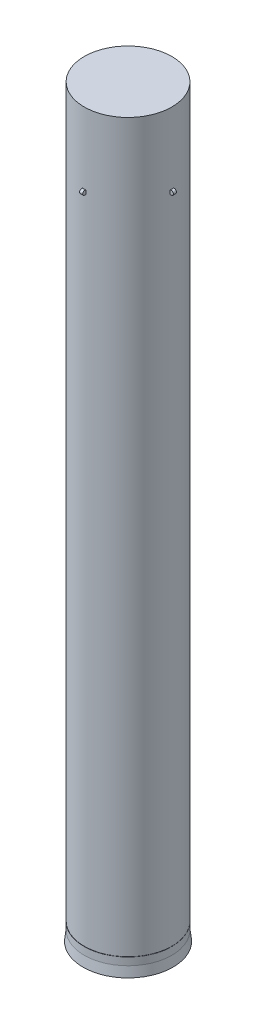
ISO-10303-21;
HEADER;
FILE_DESCRIPTION(('STEP AP214'),'2;1');
FILE_NAME('part.step','',(''),(''),'','','');
FILE_SCHEMA(('AUTOMOTIVE_DESIGN { 1 0 10303 214 1 1 1 1 }'));
ENDSEC;
DATA;
#1=APPLICATION_CONTEXT('core data for automotive mechanical design processes');
#2=APPLICATION_PROTOCOL_DEFINITION('international standard','automotive_design',2000,#1);
#3=PRODUCT_CONTEXT('',#1,'mechanical');
#4=PRODUCT('Part','Part','',(#3));
#5=PRODUCT_RELATED_PRODUCT_CATEGORY('part','',(#4));
#6=PRODUCT_DEFINITION_FORMATION('','',#4);
#7=PRODUCT_DEFINITION_CONTEXT('part definition',#1,'design');
#8=PRODUCT_DEFINITION('design','',#6,#7);
#9=PRODUCT_DEFINITION_SHAPE('','',#8);
#10=(LENGTH_UNIT() NAMED_UNIT(*) SI_UNIT(.MILLI.,.METRE.));
#11=(NAMED_UNIT(*) PLANE_ANGLE_UNIT() SI_UNIT($,.RADIAN.));
#12=(NAMED_UNIT(*) SI_UNIT($,.STERADIAN.) SOLID_ANGLE_UNIT());
#13=UNCERTAINTY_MEASURE_WITH_UNIT(LENGTH_MEASURE(1.E-05),#10,'distance_accuracy_value','');
#14=(GEOMETRIC_REPRESENTATION_CONTEXT(3) GLOBAL_UNCERTAINTY_ASSIGNED_CONTEXT((#13)) GLOBAL_UNIT_ASSIGNED_CONTEXT((#10,
#11,#12)) REPRESENTATION_CONTEXT('',''));
#15=CARTESIAN_POINT('',(0.,0.,0.));
#16=DIRECTION('',(0.,0.,1.));
#17=DIRECTION('',(1.,0.,0.));
#18=AXIS2_PLACEMENT_3D('',#15,#16,#17);
#19=CARTESIAN_POINT('',(0.,0.,0.));
#20=DIRECTION('',(0.,-1.,0.));
#21=DIRECTION('',(0.,0.,-1.));
#22=AXIS2_PLACEMENT_3D('',#19,#20,#21);
#23=CYLINDRICAL_SURFACE('',#22,4500.);
#24=CARTESIAN_POINT('',(0.,1792.,0.));
#25=DIRECTION('',(0.,1.,0.));
#26=DIRECTION('',(0.,0.,1.));
#27=AXIS2_PLACEMENT_3D('',#24,#25,#26);
#28=CIRCLE('',#27,4500.);
#29=CARTESIAN_POINT('',(0.,1792.,4500.));
#30=VERTEX_POINT('',#29);
#31=EDGE_CURVE('E194',#30,#30,#28,.T.);
#32=ORIENTED_EDGE('',*,*,#31,.F.);
#33=EDGE_LOOP('',(#32));
#34=FACE_BOUND('',#33,.T.);
#35=CARTESIAN_POINT('',(0.,1000.,0.));
#36=DIRECTION('',(0.,-1.,0.));
#37=DIRECTION('',(0.,0.,-1.));
#38=AXIS2_PLACEMENT_3D('',#35,#36,#37);
#39=CIRCLE('',#38,4500.);
#40=CARTESIAN_POINT('',(0.,1000.,-4500.));
#41=VERTEX_POINT('',#40);
#42=EDGE_CURVE('E204',#41,#41,#39,.T.);
#43=ORIENTED_EDGE('',*,*,#42,.F.);
#44=EDGE_LOOP('',(#43));
#45=FACE_BOUND('',#44,.T.);
#46=ADVANCED_FACE('F39',(#34,#45),#23,.T.);
#47=CARTESIAN_POINT('',(0.,0.,0.));
#48=DIRECTION('',(0.,-1.,0.));
#49=DIRECTION('',(0.,0.,-1.));
#50=AXIS2_PLACEMENT_3D('',#47,#48,#49);
#51=CONICAL_SURFACE('',#50,4620.,0.119428926018339);
#52=ORIENTED_EDGE('',*,*,#42,.T.);
#53=EDGE_LOOP('',(#52));
#54=FACE_BOUND('',#53,.T.);
#55=CARTESIAN_POINT('',(0.,0.,0.));
#56=DIRECTION('',(0.,-1.,0.));
#57=DIRECTION('',(0.,0.,-1.));
#58=AXIS2_PLACEMENT_3D('',#55,#56,#57);
#59=CIRCLE('',#58,4620.);
#60=CARTESIAN_POINT('',(0.,0.,-4620.));
#61=VERTEX_POINT('',#60);
#62=EDGE_CURVE('E210',#61,#61,#59,.T.);
#63=ORIENTED_EDGE('',*,*,#62,.F.);
#64=EDGE_LOOP('',(#63));
#65=FACE_BOUND('',#64,.T.);
#66=ADVANCED_FACE('F295',(#54,#65),#51,.T.);
#67=CARTESIAN_POINT('',(4620.,0.,0.));
#68=DIRECTION('',(0.,-1.,0.));
#69=DIRECTION('',(0.,0.,-1.));
#70=AXIS2_PLACEMENT_3D('',#67,#68,#69);
#71=PLANE('',#70);
#72=ORIENTED_EDGE('',*,*,#62,.T.);
#73=EDGE_LOOP('',(#72));
#74=FACE_BOUND('',#73,.T.);
#75=CARTESIAN_POINT('',(0.,0.,0.));
#76=DIRECTION('',(0.,-1.,0.));
#77=DIRECTION('',(0.,0.,-1.));
#78=AXIS2_PLACEMENT_3D('',#75,#76,#77);
#79=CIRCLE('',#78,4300.);
#80=CARTESIAN_POINT('',(0.,0.,-4300.));
#81=VERTEX_POINT('',#80);
#82=EDGE_CURVE('E209',#81,#81,#79,.T.);
#83=ORIENTED_EDGE('',*,*,#82,.F.);
#84=EDGE_LOOP('',(#83));
#85=FACE_BOUND('',#84,.T.);
#86=ADVANCED_FACE('F298',(#74,#85),#71,.T.);
#87=CARTESIAN_POINT('',(0.,0.,0.));
#88=DIRECTION('',(0.,-1.,0.));
#89=DIRECTION('',(0.,0.,-1.));
#90=AXIS2_PLACEMENT_3D('',#87,#88,#89);
#91=CYLINDRICAL_SURFACE('',#90,4300.);
#92=ORIENTED_EDGE('',*,*,#82,.T.);
#93=EDGE_LOOP('',(#92));
#94=FACE_BOUND('',#93,.T.);
#95=CARTESIAN_POINT('',(0.,73000.,0.));
#96=DIRECTION('',(0.,-1.,0.));
#97=DIRECTION('',(0.,0.,-1.));
#98=AXIS2_PLACEMENT_3D('',#95,#96,#97);
#99=CIRCLE('',#98,4300.);
#100=CARTESIAN_POINT('',(0.,73000.,-4300.));
#101=VERTEX_POINT('',#100);
#102=EDGE_CURVE('E188',#101,#101,#99,.T.);
#103=ORIENTED_EDGE('',*,*,#102,.F.);
#104=EDGE_LOOP('',(#103));
#105=FACE_BOUND('',#104,.T.);
#106=ADVANCED_FACE('F310',(#94,#105),#91,.F.);
#107=CARTESIAN_POINT('',(0.,75000.,0.));
#108=DIRECTION('',(0.,-1.,0.));
#109=DIRECTION('',(0.,0.,-1.));
#110=AXIS2_PLACEMENT_3D('',#107,#108,#109);
#111=CONICAL_SURFACE('',#110,0.,1.13544305164259);
#112=ORIENTED_EDGE('',*,*,#102,.T.);
#113=EDGE_LOOP('',(#112));
#114=FACE_BOUND('',#113,.T.);
#115=CARTESIAN_POINT('',(0.,75000.,0.));
#116=VERTEX_POINT('',#115);
#117=VERTEX_LOOP('',#116);
#118=FACE_BOUND('',#117,.T.);
#119=ADVANCED_FACE('F312',(#114,#118),#111,.F.);
#120=CARTESIAN_POINT('',(0.,1800.,0.));
#121=DIRECTION('',(0.,-1.,0.));
#122=DIRECTION('',(0.,0.,-1.));
#123=AXIS2_PLACEMENT_3D('',#120,#121,#122);
#124=TOROIDAL_SURFACE('',#123,4506.,9.99999999999967);
#125=ORIENTED_EDGE('',*,*,#31,.T.);
#126=EDGE_LOOP('',(#125));
#127=FACE_BOUND('',#126,.T.);
#128=CARTESIAN_POINT('',(0.,1808.,0.));
#129=DIRECTION('',(0.,-1.,0.));
#130=DIRECTION('',(0.,0.,-1.));
#131=AXIS2_PLACEMENT_3D('',#128,#129,#130);
#132=CIRCLE('',#131,4500.);
#133=CARTESIAN_POINT('',(0.,1808.,-4500.));
#134=VERTEX_POINT('',#133);
#135=EDGE_CURVE('E198',#134,#134,#132,.T.);
#136=ORIENTED_EDGE('',*,*,#135,.T.);
#137=EDGE_LOOP('',(#136));
#138=FACE_BOUND('',#137,.T.);
#139=ADVANCED_FACE('F162',(#127,#138),#124,.T.);
#140=CARTESIAN_POINT('',(0.,76500.,0.));
#141=DIRECTION('',(0.,1.,0.));
#142=DIRECTION('',(0.,0.,1.));
#143=AXIS2_PLACEMENT_3D('',#140,#141,#142);
#144=PLANE('',#143);
#145=CARTESIAN_POINT('',(0.,76500.,0.));
#146=DIRECTION('',(0.,-1.,0.));
#147=DIRECTION('',(0.,0.,-1.));
#148=AXIS2_PLACEMENT_3D('',#145,#146,#147);
#149=CIRCLE('',#148,4500.);
#150=CARTESIAN_POINT('',(0.,76500.,-4500.));
#151=VERTEX_POINT('',#150);
#152=EDGE_CURVE('E203',#151,#151,#149,.T.);
#153=ORIENTED_EDGE('',*,*,#152,.F.);
#154=EDGE_LOOP('',(#153));
#155=FACE_BOUND('',#154,.T.);
#156=ADVANCED_FACE('F41',(#155),#144,.T.);
#157=DIRECTION('',(0.,-1.,0.));
#158=VECTOR('',#157,1.);
#159=CARTESIAN_POINT('',(-160.,0.,4497.15465600195));
#160=LINE('',#159,#158);
#161=CARTESIAN_POINT('',(-160.,69194.4809379295,4497.15465600195));
#162=VERTEX_POINT('',#161);
#163=CARTESIAN_POINT('',(-160.,68805.5190620705,4497.15465600195));
#164=VERTEX_POINT('',#163);
#165=EDGE_CURVE('E11',#162,#164,#160,.T.);
#166=ORIENTED_EDGE('',*,*,#165,.F.);
#167=CARTESIAN_POINT('',(-160.,69194.4809379295,4497.15465600195));
#168=CARTESIAN_POINT('',(-153.335593789597,69194.6063149376,4497.39176282327));
#169=CARTESIAN_POINT('',(-146.670505032465,69194.7233250094,4497.61406057519));
#170=CARTESIAN_POINT('',(-133.339139537101,69194.9409577402,4498.02902921823));
#171=CARTESIAN_POINT('',(-126.672862799204,69195.0415804038,4498.2217001177));
#172=CARTESIAN_POINT('',(-113.339304759071,69195.226784708,4498.57740619916));
#173=CARTESIAN_POINT('',(-106.672023458367,69195.3113663729,4498.7404414259));
#174=CARTESIAN_POINT('',(-93.3366265574539,69195.4647640253,4499.03686966148));
#175=CARTESIAN_POINT('',(-86.6685109571762,69195.5335800114,4499.17026266786));
#176=CARTESIAN_POINT('',(-66.6685182895194,69195.716690718,4499.52587423657));
#177=CARTESIAN_POINT('',(-53.3356029489949,69195.8077226759,4499.70366919765));
#178=CARTESIAN_POINT('',(-26.6684584062423,69195.9289670491,4499.94073211992));
#179=CARTESIAN_POINT('',(-13.334229203121,69195.9591794227,4500.));
#180=CARTESIAN_POINT('',(13.3342292031216,69195.9591794227,4500.));
#181=CARTESIAN_POINT('',(26.6684584062429,69195.9289670491,4499.94073211992));
#182=CARTESIAN_POINT('',(53.3356029489956,69195.8077226759,4499.70366919765));
#183=CARTESIAN_POINT('',(66.66851828952,69195.716690718,4499.52587423657));
#184=CARTESIAN_POINT('',(86.6685109571769,69195.5335800114,4499.17026266786));
#185=CARTESIAN_POINT('',(93.3366265574546,69195.4647640253,4499.03686966148));
#186=CARTESIAN_POINT('',(106.672023458367,69195.3113663729,4498.7404414259));
#187=CARTESIAN_POINT('',(113.339304759072,69195.226784708,4498.57740619916));
#188=CARTESIAN_POINT('',(126.672862799205,69195.0415804038,4498.2217001177));
#189=CARTESIAN_POINT('',(133.339139537102,69194.9409577402,4498.02902921823));
#190=CARTESIAN_POINT('',(146.670505032466,69194.7233250094,4497.61406057519));
#191=CARTESIAN_POINT('',(153.335593789597,69194.6063149376,4497.39176282327));
#192=CARTESIAN_POINT('',(160.,69194.4809379295,4497.15465600195));
#193=B_SPLINE_CURVE_WITH_KNOTS('',3,(#167,#168,#169,#170,#171,#172,#173,#174,#175,#176,#177,
#178,#179,#180,#181,#182,#183,#184,#185,#186,#187,#188,#189,#190,#191,#192),.UNSPECIFIED.,.F.,
.F.,(4,2,2,2,2,2,2,2,2,2,2,2,4),(0.,20.009379155884,40.0187526619821,60.0280959502037,
80.0374409041522,120.039947029182,160.042480536044,200.045014042906,240.047520167936,
260.056865121885,280.066208410106,300.075581916205,320.084961072089),.UNSPECIFIED.);
#194=CARTESIAN_POINT('',(160.,69194.4809379295,4497.15465600195));
#195=VERTEX_POINT('',#194);
#196=EDGE_CURVE('E50',#162,#195,#193,.T.);
#197=ORIENTED_EDGE('',*,*,#196,.T.);
#198=DIRECTION('',(0.,-1.,0.));
#199=VECTOR('',#198,1.);
#200=CARTESIAN_POINT('',(160.,0.,4497.15465600195));
#201=LINE('',#200,#199);
#202=CARTESIAN_POINT('',(160.,68805.5190620705,4497.15465600195));
#203=VERTEX_POINT('',#202);
#204=EDGE_CURVE('E231',#195,#203,#201,.T.);
#205=ORIENTED_EDGE('',*,*,#204,.T.);
#206=CARTESIAN_POINT('',(160.,68805.5190620705,4497.15465600195));
#207=CARTESIAN_POINT('',(153.335593789597,68805.3936850624,4497.39176282327));
#208=CARTESIAN_POINT('',(146.670505032466,68805.2766749906,4497.61406057519));
#209=CARTESIAN_POINT('',(133.339139537102,68805.0590422598,4498.02902921823));
#210=CARTESIAN_POINT('',(126.672862799205,68804.9584195962,4498.2217001177));
#211=CARTESIAN_POINT('',(113.339304759072,68804.773215292,4498.57740619916));
#212=CARTESIAN_POINT('',(106.672023458367,68804.6886336271,4498.7404414259));
#213=CARTESIAN_POINT('',(93.3366265574545,68804.5352359747,4499.03686966148));
#214=CARTESIAN_POINT('',(86.6685109571768,68804.4664199886,4499.17026266786));
#215=CARTESIAN_POINT('',(66.6685182895199,68804.283309282,4499.52587423657));
#216=CARTESIAN_POINT('',(53.3356029489955,68804.1922773241,4499.70366919765));
#217=CARTESIAN_POINT('',(26.6684584062428,68804.0710329509,4499.94073211992));
#218=CARTESIAN_POINT('',(13.3342292031215,68804.0408205773,4500.));
#219=CARTESIAN_POINT('',(-13.3342292031211,68804.0408205773,4500.));
#220=CARTESIAN_POINT('',(-26.6684584062424,68804.0710329509,4499.94073211992));
#221=CARTESIAN_POINT('',(-53.335602948995,68804.1922773241,4499.70366919765));
#222=CARTESIAN_POINT('',(-66.6685182895194,68804.283309282,4499.52587423657));
#223=CARTESIAN_POINT('',(-86.6685109571763,68804.4664199886,4499.17026266786));
#224=CARTESIAN_POINT('',(-93.336626557454,68804.5352359747,4499.03686966148));
#225=CARTESIAN_POINT('',(-106.672023458367,68804.6886336271,4498.7404414259));
#226=CARTESIAN_POINT('',(-113.339304759071,68804.773215292,4498.57740619916));
#227=CARTESIAN_POINT('',(-126.672862799204,68804.9584195962,4498.2217001177));
#228=CARTESIAN_POINT('',(-133.339139537101,68805.0590422598,4498.02902921823));
#229=CARTESIAN_POINT('',(-146.670505032465,68805.2766749906,4497.61406057519));
#230=CARTESIAN_POINT('',(-153.335593789597,68805.3936850624,4497.39176282327));
#231=CARTESIAN_POINT('',(-160.,68805.5190620705,4497.15465600195));
#232=B_SPLINE_CURVE_WITH_KNOTS('',3,(#206,#207,#208,#209,#210,#211,#212,#213,#214,#215,#216,
#217,#218,#219,#220,#221,#222,#223,#224,#225,#226,#227,#228,#229,#230,#231),.UNSPECIFIED.,.F.,
.F.,(4,2,2,2,2,2,2,2,2,2,2,2,4),(0.,20.009379155884,40.0187526619821,60.0280959502037,
80.0374409041522,120.039947029182,160.042480536044,200.045014042906,240.047520167936,
260.056865121885,280.066208410106,300.075581916205,320.084961072089),.UNSPECIFIED.);
#233=EDGE_CURVE('E234',#203,#164,#232,.T.);
#234=ORIENTED_EDGE('',*,*,#233,.T.);
#235=EDGE_LOOP('',(#166,#197,#205,#234));
#236=FACE_BOUND('',#235,.T.);
#237=DIRECTION('',(0.,-1.,0.));
#238=VECTOR('',#237,1.);
#239=CARTESIAN_POINT('',(-4497.15465600195,0.,-159.999999999999));
#240=LINE('',#239,#238);
#241=CARTESIAN_POINT('',(-4497.15465600195,69194.4809379295,-159.999999999999));
#242=VERTEX_POINT('',#241);
#243=CARTESIAN_POINT('',(-4497.15465600195,68805.5190620705,-159.999999999999));
#244=VERTEX_POINT('',#243);
#245=EDGE_CURVE('E240',#242,#244,#240,.T.);
#246=ORIENTED_EDGE('',*,*,#245,.F.);
#247=CARTESIAN_POINT('',(-4497.15465600195,69194.4809379295,-159.999999999999));
#248=CARTESIAN_POINT('',(-4497.39176282327,69194.6063149376,-153.335593789596));
#249=CARTESIAN_POINT('',(-4497.61406057519,69194.7233250094,-146.670505032465));
#250=CARTESIAN_POINT('',(-4498.02902921823,69194.9409577402,-133.339139537101));
#251=CARTESIAN_POINT('',(-4498.2217001177,69195.0415804038,-126.672862799204));
#252=CARTESIAN_POINT('',(-4498.57740619916,69195.226784708,-113.339304759071));
#253=CARTESIAN_POINT('',(-4498.7404414259,69195.3113663729,-106.672023458366));
#254=CARTESIAN_POINT('',(-4499.03686966148,69195.4647640253,-93.3366265574536));
#255=CARTESIAN_POINT('',(-4499.17026266786,69195.5335800114,-86.668510957176));
#256=CARTESIAN_POINT('',(-4499.52587423657,69195.716690718,-66.668518289519));
#257=CARTESIAN_POINT('',(-4499.70366919765,69195.8077226759,-53.3356029489946));
#258=CARTESIAN_POINT('',(-4499.94073211992,69195.9289670491,-26.668458406242));
#259=CARTESIAN_POINT('',(-4500.,69195.9591794227,-13.3342292031207));
#260=CARTESIAN_POINT('',(-4500.,69195.9591794227,13.3342292031219));
#261=CARTESIAN_POINT('',(-4499.94073211992,69195.9289670491,26.6684584062433));
#262=CARTESIAN_POINT('',(-4499.70366919765,69195.8077226759,53.3356029489959));
#263=CARTESIAN_POINT('',(-4499.52587423657,69195.716690718,66.6685182895203));
#264=CARTESIAN_POINT('',(-4499.17026266786,69195.5335800114,86.6685109571772));
#265=CARTESIAN_POINT('',(-4499.03686966148,69195.4647640253,93.3366265574549));
#266=CARTESIAN_POINT('',(-4498.7404414259,69195.3113663729,106.672023458368));
#267=CARTESIAN_POINT('',(-4498.57740619916,69195.226784708,113.339304759072));
#268=CARTESIAN_POINT('',(-4498.2217001177,69195.0415804038,126.672862799205));
#269=CARTESIAN_POINT('',(-4498.02902921822,69194.9409577402,133.339139537102));
#270=CARTESIAN_POINT('',(-4497.61406057519,69194.7233250094,146.670505032466));
#271=CARTESIAN_POINT('',(-4497.39176282327,69194.6063149376,153.335593789598));
#272=CARTESIAN_POINT('',(-4497.15465600195,69194.4809379295,160.000000000001));
#273=B_SPLINE_CURVE_WITH_KNOTS('',3,(#247,#248,#249,#250,#251,#252,#253,#254,#255,#256,#257,
#258,#259,#260,#261,#262,#263,#264,#265,#266,#267,#268,#269,#270,#271,#272),.UNSPECIFIED.,.F.,
.F.,(4,2,2,2,2,2,2,2,2,2,2,2,4),(0.,20.009379155884,40.0187526619821,60.0280959502037,
80.0374409041522,120.039947029182,160.042480536044,200.045014042906,240.047520167937,
260.056865121885,280.066208410107,300.075581916205,320.084961072089),.UNSPECIFIED.);
#274=CARTESIAN_POINT('',(-4497.15465600195,69194.4809379295,160.000000000001));
#275=VERTEX_POINT('',#274);
#276=EDGE_CURVE('E277',#242,#275,#273,.T.);
#277=ORIENTED_EDGE('',*,*,#276,.T.);
#278=DIRECTION('',(0.,-1.,0.));
#279=VECTOR('',#278,1.);
#280=CARTESIAN_POINT('',(-4497.15465600195,0.,160.000000000001));
#281=LINE('',#280,#279);
#282=CARTESIAN_POINT('',(-4497.15465600195,68805.5190620705,160.000000000001));
#283=VERTEX_POINT('',#282);
#284=EDGE_CURVE('E126',#275,#283,#281,.T.);
#285=ORIENTED_EDGE('',*,*,#284,.T.);
#286=CARTESIAN_POINT('',(-4497.15465600195,68805.5190620705,160.000000000001));
#287=CARTESIAN_POINT('',(-4497.39176282327,68805.3936850624,153.335593789598));
#288=CARTESIAN_POINT('',(-4497.61406057519,68805.2766749906,146.670505032466));
#289=CARTESIAN_POINT('',(-4498.02902921822,68805.0590422598,133.339139537102));
#290=CARTESIAN_POINT('',(-4498.2217001177,68804.9584195962,126.672862799205));
#291=CARTESIAN_POINT('',(-4498.57740619916,68804.773215292,113.339304759072));
#292=CARTESIAN_POINT('',(-4498.7404414259,68804.6886336271,106.672023458368));
#293=CARTESIAN_POINT('',(-4499.03686966148,68804.5352359747,93.3366265574548));
#294=CARTESIAN_POINT('',(-4499.17026266786,68804.4664199886,86.6685109571771));
#295=CARTESIAN_POINT('',(-4499.52587423657,68804.283309282,66.6685182895202));
#296=CARTESIAN_POINT('',(-4499.70366919765,68804.1922773241,53.3356029489958));
#297=CARTESIAN_POINT('',(-4499.94073211992,68804.0710329509,26.6684584062431));
#298=CARTESIAN_POINT('',(-4500.,68804.0408205773,13.3342292031218));
#299=CARTESIAN_POINT('',(-4500.,68804.0408205773,-13.3342292031208));
#300=CARTESIAN_POINT('',(-4499.94073211992,68804.0710329509,-26.6684584062421));
#301=CARTESIAN_POINT('',(-4499.70366919765,68804.1922773241,-53.3356029489947));
#302=CARTESIAN_POINT('',(-4499.52587423657,68804.283309282,-66.6685182895192));
#303=CARTESIAN_POINT('',(-4499.17026266786,68804.4664199886,-86.6685109571761));
#304=CARTESIAN_POINT('',(-4499.03686966148,68804.5352359747,-93.3366265574537));
#305=CARTESIAN_POINT('',(-4498.7404414259,68804.6886336271,-106.672023458366));
#306=CARTESIAN_POINT('',(-4498.57740619916,68804.773215292,-113.339304759071));
#307=CARTESIAN_POINT('',(-4498.2217001177,68804.9584195962,-126.672862799204));
#308=CARTESIAN_POINT('',(-4498.02902921823,68805.0590422598,-133.339139537101));
#309=CARTESIAN_POINT('',(-4497.61406057519,68805.2766749906,-146.670505032465));
#310=CARTESIAN_POINT('',(-4497.39176282327,68805.3936850624,-153.335593789597));
#311=CARTESIAN_POINT('',(-4497.15465600195,68805.5190620705,-160.));
#312=B_SPLINE_CURVE_WITH_KNOTS('',3,(#286,#287,#288,#289,#290,#291,#292,#293,#294,#295,#296,
#297,#298,#299,#300,#301,#302,#303,#304,#305,#306,#307,#308,#309,#310,#311),.UNSPECIFIED.,.F.,
.F.,(4,2,2,2,2,2,2,2,2,2,2,2,4),(0.,20.0093791558839,40.0187526619821,60.0280959502037,
80.0374409041522,120.039947029182,160.042480536044,200.045014042906,240.047520167937,
260.056865121885,280.066208410107,300.075581916205,320.084961072089),.UNSPECIFIED.);
#313=EDGE_CURVE('E269',#283,#244,#312,.T.);
#314=ORIENTED_EDGE('',*,*,#313,.T.);
#315=EDGE_LOOP('',(#246,#277,#285,#314));
#316=FACE_BOUND('',#315,.T.);
#317=DIRECTION('',(0.,-1.,0.));
#318=VECTOR('',#317,1.);
#319=CARTESIAN_POINT('',(159.999999999999,0.,-4497.15465600195));
#320=LINE('',#319,#318);
#321=CARTESIAN_POINT('',(159.999999999999,69194.4809379295,-4497.15465600195));
#322=VERTEX_POINT('',#321);
#323=CARTESIAN_POINT('',(159.999999999999,68805.5190620705,-4497.15465600195));
#324=VERTEX_POINT('',#323);
#325=EDGE_CURVE('E127',#322,#324,#320,.T.);
#326=ORIENTED_EDGE('',*,*,#325,.F.);
#327=CARTESIAN_POINT('',(159.999999999999,69194.4809379295,-4497.15465600195));
#328=CARTESIAN_POINT('',(153.335593789596,69194.6063149376,-4497.39176282327));
#329=CARTESIAN_POINT('',(146.670505032465,69194.7233250094,-4497.61406057519));
#330=CARTESIAN_POINT('',(133.3391395371,69194.9409577402,-4498.02902921823));
#331=CARTESIAN_POINT('',(126.672862799204,69195.0415804038,-4498.2217001177));
#332=CARTESIAN_POINT('',(113.339304759071,69195.226784708,-4498.57740619916));
#333=CARTESIAN_POINT('',(106.672023458366,69195.3113663729,-4498.7404414259));
#334=CARTESIAN_POINT('',(93.3366265574534,69195.4647640253,-4499.03686966148));
#335=CARTESIAN_POINT('',(86.6685109571757,69195.5335800114,-4499.17026266786));
#336=CARTESIAN_POINT('',(66.6685182895188,69195.716690718,-4499.52587423657));
#337=CARTESIAN_POINT('',(53.3356029489944,69195.8077226759,-4499.70366919765));
#338=CARTESIAN_POINT('',(26.6684584062417,69195.9289670491,-4499.94073211992));
#339=CARTESIAN_POINT('',(13.3342292031204,69195.9591794227,-4500.));
#340=CARTESIAN_POINT('',(-13.3342292031222,69195.9591794227,-4500.));
#341=CARTESIAN_POINT('',(-26.6684584062435,69195.9289670491,-4499.94073211992));
#342=CARTESIAN_POINT('',(-53.3356029489961,69195.8077226759,-4499.70366919765));
#343=CARTESIAN_POINT('',(-66.6685182895206,69195.716690718,-4499.52587423657));
#344=CARTESIAN_POINT('',(-86.6685109571774,69195.5335800114,-4499.17026266786));
#345=CARTESIAN_POINT('',(-93.3366265574551,69195.4647640253,-4499.03686966148));
#346=CARTESIAN_POINT('',(-106.672023458368,69195.3113663729,-4498.7404414259));
#347=CARTESIAN_POINT('',(-113.339304759072,69195.226784708,-4498.57740619916));
#348=CARTESIAN_POINT('',(-126.672862799206,69195.0415804038,-4498.2217001177));
#349=CARTESIAN_POINT('',(-133.339139537102,69194.9409577402,-4498.02902921822));
#350=CARTESIAN_POINT('',(-146.670505032466,69194.7233250094,-4497.61406057519));
#351=CARTESIAN_POINT('',(-153.335593789598,69194.6063149376,-4497.39176282327));
#352=CARTESIAN_POINT('',(-160.000000000001,69194.4809379295,-4497.15465600195));
#353=B_SPLINE_CURVE_WITH_KNOTS('',3,(#327,#328,#329,#330,#331,#332,#333,#334,#335,#336,#337,
#338,#339,#340,#341,#342,#343,#344,#345,#346,#347,#348,#349,#350,#351,#352),.UNSPECIFIED.,.F.,
.F.,(4,2,2,2,2,2,2,2,2,2,2,2,4),(0.,20.009379155884,40.0187526619821,60.0280959502037,
80.0374409041522,120.039947029182,160.042480536044,200.045014042906,240.047520167936,
260.056865121885,280.066208410106,300.075581916205,320.084961072089),.UNSPECIFIED.);
#354=CARTESIAN_POINT('',(-160.000000000001,69194.4809379295,-4497.15465600195));
#355=VERTEX_POINT('',#354);
#356=EDGE_CURVE('E118',#322,#355,#353,.T.);
#357=ORIENTED_EDGE('',*,*,#356,.T.);
#358=DIRECTION('',(0.,-1.,0.));
#359=VECTOR('',#358,1.);
#360=CARTESIAN_POINT('',(-160.000000000001,0.,-4497.15465600195));
#361=LINE('',#360,#359);
#362=CARTESIAN_POINT('',(-160.000000000001,68805.5190620705,-4497.15465600195));
#363=VERTEX_POINT('',#362);
#364=EDGE_CURVE('E104',#355,#363,#361,.T.);
#365=ORIENTED_EDGE('',*,*,#364,.T.);
#366=CARTESIAN_POINT('',(-160.000000000001,68805.5190620705,-4497.15465600195));
#367=CARTESIAN_POINT('',(-153.335593789598,68805.3936850624,-4497.39176282327));
#368=CARTESIAN_POINT('',(-146.670505032466,68805.2766749906,-4497.61406057519));
#369=CARTESIAN_POINT('',(-133.339139537102,68805.0590422598,-4498.02902921822));
#370=CARTESIAN_POINT('',(-126.672862799206,68804.9584195962,-4498.2217001177));
#371=CARTESIAN_POINT('',(-113.339304759072,68804.773215292,-4498.57740619916));
#372=CARTESIAN_POINT('',(-106.672023458368,68804.6886336271,-4498.7404414259));
#373=CARTESIAN_POINT('',(-93.336626557455,68804.5352359747,-4499.03686966148));
#374=CARTESIAN_POINT('',(-86.6685109571774,68804.4664199886,-4499.17026266786));
#375=CARTESIAN_POINT('',(-66.6685182895205,68804.283309282,-4499.52587423657));
#376=CARTESIAN_POINT('',(-53.335602948996,68804.1922773241,-4499.70366919765));
#377=CARTESIAN_POINT('',(-26.6684584062434,68804.0710329509,-4499.94073211992));
#378=CARTESIAN_POINT('',(-13.3342292031221,68804.0408205773,-4500.));
#379=CARTESIAN_POINT('',(13.3342292031205,68804.0408205773,-4500.));
#380=CARTESIAN_POINT('',(26.6684584062418,68804.0710329509,-4499.94073211992));
#381=CARTESIAN_POINT('',(53.3356029489945,68804.1922773241,-4499.70366919765));
#382=CARTESIAN_POINT('',(66.6685182895189,68804.283309282,-4499.52587423657));
#383=CARTESIAN_POINT('',(86.6685109571758,68804.4664199886,-4499.17026266786));
#384=CARTESIAN_POINT('',(93.3366265574535,68804.5352359747,-4499.03686966148));
#385=CARTESIAN_POINT('',(106.672023458366,68804.6886336271,-4498.7404414259));
#386=CARTESIAN_POINT('',(113.339304759071,68804.773215292,-4498.57740619916));
#387=CARTESIAN_POINT('',(126.672862799204,68804.9584195962,-4498.2217001177));
#388=CARTESIAN_POINT('',(133.3391395371,68805.0590422598,-4498.02902921823));
#389=CARTESIAN_POINT('',(146.670505032465,68805.2766749906,-4497.61406057519));
#390=CARTESIAN_POINT('',(153.335593789596,68805.3936850624,-4497.39176282327));
#391=CARTESIAN_POINT('',(159.999999999999,68805.5190620705,-4497.15465600195));
#392=B_SPLINE_CURVE_WITH_KNOTS('',3,(#366,#367,#368,#369,#370,#371,#372,#373,#374,#375,#376,
#377,#378,#379,#380,#381,#382,#383,#384,#385,#386,#387,#388,#389,#390,#391),.UNSPECIFIED.,.F.,
.F.,(4,2,2,2,2,2,2,2,2,2,2,2,4),(0.,20.0093791558839,40.0187526619821,60.0280959502037,
80.0374409041522,120.039947029182,160.042480536044,200.045014042906,240.047520167936,
260.056865121885,280.066208410106,300.075581916205,320.084961072089),.UNSPECIFIED.);
#393=EDGE_CURVE('E114',#363,#324,#392,.T.);
#394=ORIENTED_EDGE('',*,*,#393,.T.);
#395=EDGE_LOOP('',(#326,#357,#365,#394));
#396=FACE_BOUND('',#395,.T.);
#397=DIRECTION('',(0.,-1.,0.));
#398=VECTOR('',#397,1.);
#399=CARTESIAN_POINT('',(4497.15465600195,0.,160.));
#400=LINE('',#399,#398);
#401=CARTESIAN_POINT('',(4497.15465600195,69194.4809379295,160.));
#402=VERTEX_POINT('',#401);
#403=CARTESIAN_POINT('',(4497.15465600195,68805.5190620705,160.));
#404=VERTEX_POINT('',#403);
#405=EDGE_CURVE('E111',#402,#404,#400,.T.);
#406=ORIENTED_EDGE('',*,*,#405,.F.);
#407=CARTESIAN_POINT('',(4497.15465600195,69194.4809379295,160.));
#408=CARTESIAN_POINT('',(4497.39176282327,69194.6063149376,153.335593789597));
#409=CARTESIAN_POINT('',(4497.61406057519,69194.7233250094,146.670505032465));
#410=CARTESIAN_POINT('',(4498.02902921823,69194.9409577402,133.339139537101));
#411=CARTESIAN_POINT('',(4498.2217001177,69195.0415804038,126.672862799205));
#412=CARTESIAN_POINT('',(4498.57740619916,69195.226784708,113.339304759071));
#413=CARTESIAN_POINT('',(4498.7404414259,69195.3113663729,106.672023458367));
#414=CARTESIAN_POINT('',(4499.03686966148,69195.4647640253,93.3366265574542));
#415=CARTESIAN_POINT('',(4499.17026266786,69195.5335800114,86.6685109571765));
#416=CARTESIAN_POINT('',(4499.52587423657,69195.716690718,66.6685182895196));
#417=CARTESIAN_POINT('',(4499.70366919765,69195.8077226759,53.3356029489952));
#418=CARTESIAN_POINT('',(4499.94073211992,69195.9289670491,26.6684584062426));
#419=CARTESIAN_POINT('',(4500.,69195.9591794227,13.3342292031213));
#420=CARTESIAN_POINT('',(4500.,69195.9591794227,-13.3342292031214));
#421=CARTESIAN_POINT('',(4499.94073211992,69195.9289670491,-26.6684584062427));
#422=CARTESIAN_POINT('',(4499.70366919765,69195.8077226759,-53.3356029489953));
#423=CARTESIAN_POINT('',(4499.52587423657,69195.716690718,-66.6685182895197));
#424=CARTESIAN_POINT('',(4499.17026266786,69195.5335800114,-86.6685109571766));
#425=CARTESIAN_POINT('',(4499.03686966148,69195.4647640253,-93.3366265574543));
#426=CARTESIAN_POINT('',(4498.7404414259,69195.3113663729,-106.672023458367));
#427=CARTESIAN_POINT('',(4498.57740619916,69195.226784708,-113.339304759071));
#428=CARTESIAN_POINT('',(4498.2217001177,69195.0415804038,-126.672862799205));
#429=CARTESIAN_POINT('',(4498.02902921823,69194.9409577402,-133.339139537101));
#430=CARTESIAN_POINT('',(4497.61406057519,69194.7233250094,-146.670505032466));
#431=CARTESIAN_POINT('',(4497.39176282327,69194.6063149376,-153.335593789597));
#432=CARTESIAN_POINT('',(4497.15465600195,69194.4809379295,-160.));
#433=B_SPLINE_CURVE_WITH_KNOTS('',3,(#407,#408,#409,#410,#411,#412,#413,#414,#415,#416,#417,
#418,#419,#420,#421,#422,#423,#424,#425,#426,#427,#428,#429,#430,#431,#432),.UNSPECIFIED.,.F.,
.F.,(4,2,2,2,2,2,2,2,2,2,2,2,4),(0.,20.009379155884,40.0187526619821,60.0280959502037,
80.0374409041522,120.039947029182,160.042480536044,200.045014042906,240.047520167936,
260.056865121885,280.066208410106,300.075581916205,320.084961072089),.UNSPECIFIED.);
#434=CARTESIAN_POINT('',(4497.15465600195,69194.4809379295,-160.));
#435=VERTEX_POINT('',#434);
#436=EDGE_CURVE('E173',#402,#435,#433,.T.);
#437=ORIENTED_EDGE('',*,*,#436,.T.);
#438=DIRECTION('',(0.,-1.,0.));
#439=VECTOR('',#438,1.);
#440=CARTESIAN_POINT('',(4497.15465600195,0.,-160.));
#441=LINE('',#440,#439);
#442=CARTESIAN_POINT('',(4497.15465600195,68805.5190620705,-160.));
#443=VERTEX_POINT('',#442);
#444=EDGE_CURVE('E193',#435,#443,#441,.T.);
#445=ORIENTED_EDGE('',*,*,#444,.T.);
#446=CARTESIAN_POINT('',(4497.15465600195,68805.5190620705,-160.));
#447=CARTESIAN_POINT('',(4497.39176282327,68805.3936850624,-153.335593789597));
#448=CARTESIAN_POINT('',(4497.61406057519,68805.2766749906,-146.670505032465));
#449=CARTESIAN_POINT('',(4498.02902921823,68805.0590422598,-133.339139537101));
#450=CARTESIAN_POINT('',(4498.2217001177,68804.9584195962,-126.672862799205));
#451=CARTESIAN_POINT('',(4498.57740619916,68804.773215292,-113.339304759071));
#452=CARTESIAN_POINT('',(4498.7404414259,68804.6886336271,-106.672023458367));
#453=CARTESIAN_POINT('',(4499.03686966148,68804.5352359747,-93.3366265574542));
#454=CARTESIAN_POINT('',(4499.17026266786,68804.4664199886,-86.6685109571765));
#455=CARTESIAN_POINT('',(4499.52587423657,68804.283309282,-66.6685182895196));
#456=CARTESIAN_POINT('',(4499.70366919765,68804.1922773241,-53.3356029489952));
#457=CARTESIAN_POINT('',(4499.94073211992,68804.0710329509,-26.6684584062426));
#458=CARTESIAN_POINT('',(4500.,68804.0408205773,-13.3342292031213));
#459=CARTESIAN_POINT('',(4500.,68804.0408205773,13.3342292031214));
#460=CARTESIAN_POINT('',(4499.94073211992,68804.0710329509,26.6684584062427));
#461=CARTESIAN_POINT('',(4499.70366919765,68804.1922773241,53.3356029489953));
#462=CARTESIAN_POINT('',(4499.52587423657,68804.283309282,66.6685182895197));
#463=CARTESIAN_POINT('',(4499.17026266786,68804.4664199886,86.6685109571766));
#464=CARTESIAN_POINT('',(4499.03686966148,68804.5352359747,93.3366265574543));
#465=CARTESIAN_POINT('',(4498.7404414259,68804.6886336271,106.672023458367));
#466=CARTESIAN_POINT('',(4498.57740619916,68804.773215292,113.339304759071));
#467=CARTESIAN_POINT('',(4498.2217001177,68804.9584195962,126.672862799205));
#468=CARTESIAN_POINT('',(4498.02902921823,68805.0590422598,133.339139537101));
#469=CARTESIAN_POINT('',(4497.61406057519,68805.2766749906,146.670505032466));
#470=CARTESIAN_POINT('',(4497.39176282327,68805.3936850624,153.335593789597));
#471=CARTESIAN_POINT('',(4497.15465600195,68805.5190620705,160.));
#472=B_SPLINE_CURVE_WITH_KNOTS('',3,(#446,#447,#448,#449,#450,#451,#452,#453,#454,#455,#456,
#457,#458,#459,#460,#461,#462,#463,#464,#465,#466,#467,#468,#469,#470,#471),.UNSPECIFIED.,.F.,
.F.,(4,2,2,2,2,2,2,2,2,2,2,2,4),(0.,20.009379155884,40.0187526619821,60.0280959502037,
80.0374409041522,120.039947029182,160.042480536044,200.045014042906,240.047520167936,
260.056865121885,280.066208410106,300.075581916205,320.084961072089),.UNSPECIFIED.);
#473=EDGE_CURVE('E170',#443,#404,#472,.T.);
#474=ORIENTED_EDGE('',*,*,#473,.T.);
#475=EDGE_LOOP('',(#406,#437,#445,#474));
#476=FACE_BOUND('',#475,.T.);
#477=ORIENTED_EDGE('',*,*,#135,.F.);
#478=EDGE_LOOP('',(#477));
#479=FACE_BOUND('',#478,.T.);
#480=ORIENTED_EDGE('',*,*,#152,.T.);
#481=EDGE_LOOP('',(#480));
#482=FACE_BOUND('',#481,.T.);
#483=ADVANCED_FACE('F124',(#236,#316,#396,#476,#479,#482),#23,.T.);
#484=CARTESIAN_POINT('',(4600.,69000.,160.));
#485=DIRECTION('',(0.,0.,-1.));
#486=DIRECTION('',(-1.,0.,0.));
#487=AXIS2_PLACEMENT_3D('',#484,#485,#486);
#488=CYLINDRICAL_SURFACE('',#487,220.);
#489=ORIENTED_EDGE('',*,*,#436,.F.);
#490=CARTESIAN_POINT('',(4600.,69000.,160.));
#491=DIRECTION('',(0.,0.,1.));
#492=DIRECTION('',(1.,0.,0.));
#493=AXIS2_PLACEMENT_3D('',#490,#491,#492);
#494=CIRCLE('',#493,220.);
#495=EDGE_CURVE('E184',#404,#402,#494,.T.);
#496=ORIENTED_EDGE('',*,*,#495,.F.);
#497=ORIENTED_EDGE('',*,*,#473,.F.);
#498=CARTESIAN_POINT('',(4600.,69000.,-160.));
#499=DIRECTION('',(0.,0.,1.));
#500=DIRECTION('',(1.,0.,0.));
#501=AXIS2_PLACEMENT_3D('',#498,#499,#500);
#502=CIRCLE('',#501,220.);
#503=EDGE_CURVE('E187',#443,#435,#502,.T.);
#504=ORIENTED_EDGE('',*,*,#503,.T.);
#505=EDGE_LOOP('',(#489,#496,#497,#504));
#506=FACE_BOUND('',#505,.T.);
#507=ADVANCED_FACE('F152',(#506),#488,.T.);
#508=CARTESIAN_POINT('',(4600.,69000.,160.));
#509=DIRECTION('',(0.,0.,1.));
#510=DIRECTION('',(1.,0.,0.));
#511=AXIS2_PLACEMENT_3D('',#508,#509,#510);
#512=PLANE('',#511);
#513=ORIENTED_EDGE('',*,*,#495,.T.);
#514=ORIENTED_EDGE('',*,*,#405,.T.);
#515=EDGE_LOOP('',(#513,#514));
#516=FACE_BOUND('',#515,.T.);
#517=ADVANCED_FACE('F147',(#516),#512,.T.);
#518=CARTESIAN_POINT('',(4600.,69000.,-160.));
#519=DIRECTION('',(0.,0.,1.));
#520=DIRECTION('',(1.,0.,0.));
#521=AXIS2_PLACEMENT_3D('',#518,#519,#520);
#522=PLANE('',#521);
#523=ORIENTED_EDGE('',*,*,#444,.F.);
#524=ORIENTED_EDGE('',*,*,#503,.F.);
#525=EDGE_LOOP('',(#523,#524));
#526=FACE_BOUND('',#525,.T.);
#527=ADVANCED_FACE('F146',(#526),#522,.F.);
#528=CARTESIAN_POINT('',(159.999999999999,69000.,-4600.));
#529=DIRECTION('',(-1.,0.,0.));
#530=DIRECTION('',(0.,0.,1.));
#531=AXIS2_PLACEMENT_3D('',#528,#529,#530);
#532=CYLINDRICAL_SURFACE('',#531,220.);
#533=ORIENTED_EDGE('',*,*,#356,.F.);
#534=CARTESIAN_POINT('',(159.999999999999,69000.,-4600.));
#535=DIRECTION('',(1.,0.,0.));
#536=DIRECTION('',(0.,0.,-1.));
#537=AXIS2_PLACEMENT_3D('',#534,#535,#536);
#538=CIRCLE('',#537,220.);
#539=EDGE_CURVE('E122',#324,#322,#538,.T.);
#540=ORIENTED_EDGE('',*,*,#539,.F.);
#541=ORIENTED_EDGE('',*,*,#393,.F.);
#542=CARTESIAN_POINT('',(-160.000000000001,69000.,-4600.));
#543=DIRECTION('',(1.,0.,0.));
#544=DIRECTION('',(0.,0.,-1.));
#545=AXIS2_PLACEMENT_3D('',#542,#543,#544);
#546=CIRCLE('',#545,220.);
#547=EDGE_CURVE('E107',#363,#355,#546,.T.);
#548=ORIENTED_EDGE('',*,*,#547,.T.);
#549=EDGE_LOOP('',(#533,#540,#541,#548));
#550=FACE_BOUND('',#549,.T.);
#551=ADVANCED_FACE('F116',(#550),#532,.T.);
#552=CARTESIAN_POINT('',(159.999999999999,69000.,-4600.));
#553=DIRECTION('',(1.,0.,0.));
#554=DIRECTION('',(0.,0.,-1.));
#555=AXIS2_PLACEMENT_3D('',#552,#553,#554);
#556=PLANE('',#555);
#557=ORIENTED_EDGE('',*,*,#539,.T.);
#558=ORIENTED_EDGE('',*,*,#325,.T.);
#559=EDGE_LOOP('',(#557,#558));
#560=FACE_BOUND('',#559,.T.);
#561=ADVANCED_FACE('F150',(#560),#556,.T.);
#562=CARTESIAN_POINT('',(-160.000000000001,69000.,-4600.));
#563=DIRECTION('',(1.,0.,0.));
#564=DIRECTION('',(0.,0.,-1.));
#565=AXIS2_PLACEMENT_3D('',#562,#563,#564);
#566=PLANE('',#565);
#567=ORIENTED_EDGE('',*,*,#364,.F.);
#568=ORIENTED_EDGE('',*,*,#547,.F.);
#569=EDGE_LOOP('',(#567,#568));
#570=FACE_BOUND('',#569,.T.);
#571=ADVANCED_FACE('F110',(#570),#566,.F.);
#572=CARTESIAN_POINT('',(-4600.,69000.,-159.999999999999));
#573=DIRECTION('',(0.,0.,1.));
#574=DIRECTION('',(1.,0.,0.));
#575=AXIS2_PLACEMENT_3D('',#572,#573,#574);
#576=CYLINDRICAL_SURFACE('',#575,220.);
#577=ORIENTED_EDGE('',*,*,#276,.F.);
#578=CARTESIAN_POINT('',(-4600.,69000.,-159.999999999999));
#579=DIRECTION('',(0.,0.,-1.));
#580=DIRECTION('',(-1.,0.,0.));
#581=AXIS2_PLACEMENT_3D('',#578,#579,#580);
#582=CIRCLE('',#581,220.);
#583=EDGE_CURVE('E218',#244,#242,#582,.T.);
#584=ORIENTED_EDGE('',*,*,#583,.F.);
#585=ORIENTED_EDGE('',*,*,#313,.F.);
#586=CARTESIAN_POINT('',(-4600.,69000.,160.000000000001));
#587=DIRECTION('',(0.,0.,-1.));
#588=DIRECTION('',(-1.,0.,0.));
#589=AXIS2_PLACEMENT_3D('',#586,#587,#588);
#590=CIRCLE('',#589,220.);
#591=EDGE_CURVE('E58',#283,#275,#590,.T.);
#592=ORIENTED_EDGE('',*,*,#591,.T.);
#593=EDGE_LOOP('',(#577,#584,#585,#592));
#594=FACE_BOUND('',#593,.T.);
#595=ADVANCED_FACE('F261',(#594),#576,.T.);
#596=CARTESIAN_POINT('',(-4600.,69000.,-159.999999999999));
#597=DIRECTION('',(0.,0.,-1.));
#598=DIRECTION('',(-1.,0.,0.));
#599=AXIS2_PLACEMENT_3D('',#596,#597,#598);
#600=PLANE('',#599);
#601=ORIENTED_EDGE('',*,*,#583,.T.);
#602=ORIENTED_EDGE('',*,*,#245,.T.);
#603=EDGE_LOOP('',(#601,#602));
#604=FACE_BOUND('',#603,.T.);
#605=ADVANCED_FACE('F260',(#604),#600,.T.);
#606=CARTESIAN_POINT('',(-4600.,69000.,160.000000000001));
#607=DIRECTION('',(0.,0.,-1.));
#608=DIRECTION('',(-1.,0.,0.));
#609=AXIS2_PLACEMENT_3D('',#606,#607,#608);
#610=PLANE('',#609);
#611=ORIENTED_EDGE('',*,*,#284,.F.);
#612=ORIENTED_EDGE('',*,*,#591,.F.);
#613=EDGE_LOOP('',(#611,#612));
#614=FACE_BOUND('',#613,.T.);
#615=ADVANCED_FACE('F255',(#614),#610,.F.);
#616=CARTESIAN_POINT('',(-160.,69000.,4600.));
#617=DIRECTION('',(1.,0.,0.));
#618=DIRECTION('',(0.,0.,-1.));
#619=AXIS2_PLACEMENT_3D('',#616,#617,#618);
#620=CYLINDRICAL_SURFACE('',#619,220.);
#621=ORIENTED_EDGE('',*,*,#196,.F.);
#622=CARTESIAN_POINT('',(-160.,69000.,4600.));
#623=DIRECTION('',(-1.,0.,0.));
#624=DIRECTION('',(0.,0.,1.));
#625=AXIS2_PLACEMENT_3D('',#622,#623,#624);
#626=CIRCLE('',#625,220.);
#627=EDGE_CURVE('E214',#164,#162,#626,.T.);
#628=ORIENTED_EDGE('',*,*,#627,.F.);
#629=ORIENTED_EDGE('',*,*,#233,.F.);
#630=CARTESIAN_POINT('',(160.,69000.,4600.));
#631=DIRECTION('',(-1.,0.,0.));
#632=DIRECTION('',(0.,0.,1.));
#633=AXIS2_PLACEMENT_3D('',#630,#631,#632);
#634=CIRCLE('',#633,220.);
#635=EDGE_CURVE('E52',#203,#195,#634,.T.);
#636=ORIENTED_EDGE('',*,*,#635,.T.);
#637=EDGE_LOOP('',(#621,#628,#629,#636));
#638=FACE_BOUND('',#637,.T.);
#639=ADVANCED_FACE('F249',(#638),#620,.T.);
#640=CARTESIAN_POINT('',(-160.,69000.,4600.));
#641=DIRECTION('',(-1.,0.,0.));
#642=DIRECTION('',(0.,0.,1.));
#643=AXIS2_PLACEMENT_3D('',#640,#641,#642);
#644=PLANE('',#643);
#645=ORIENTED_EDGE('',*,*,#627,.T.);
#646=ORIENTED_EDGE('',*,*,#165,.T.);
#647=EDGE_LOOP('',(#645,#646));
#648=FACE_BOUND('',#647,.T.);
#649=ADVANCED_FACE('F226',(#648),#644,.T.);
#650=CARTESIAN_POINT('',(160.,69000.,4600.));
#651=DIRECTION('',(-1.,0.,0.));
#652=DIRECTION('',(0.,0.,1.));
#653=AXIS2_PLACEMENT_3D('',#650,#651,#652);
#654=PLANE('',#653);
#655=ORIENTED_EDGE('',*,*,#204,.F.);
#656=ORIENTED_EDGE('',*,*,#635,.F.);
#657=EDGE_LOOP('',(#655,#656));
#658=FACE_BOUND('',#657,.T.);
#659=ADVANCED_FACE('F254',(#658),#654,.F.);
#660=CLOSED_SHELL('',(#46,#66,#86,#106,#119,#139,#156,#483,#507,#517,#527,#551,#561,#571,#595,
#605,#615,#639,#649,#659));
#661=MANIFOLD_SOLID_BREP('B2',#660);
#662=ADVANCED_BREP_SHAPE_REPRESENTATION('',(#18,#661),#14);
#663=SHAPE_DEFINITION_REPRESENTATION(#9,#662);
ENDSEC;
END-ISO-10303-21;
